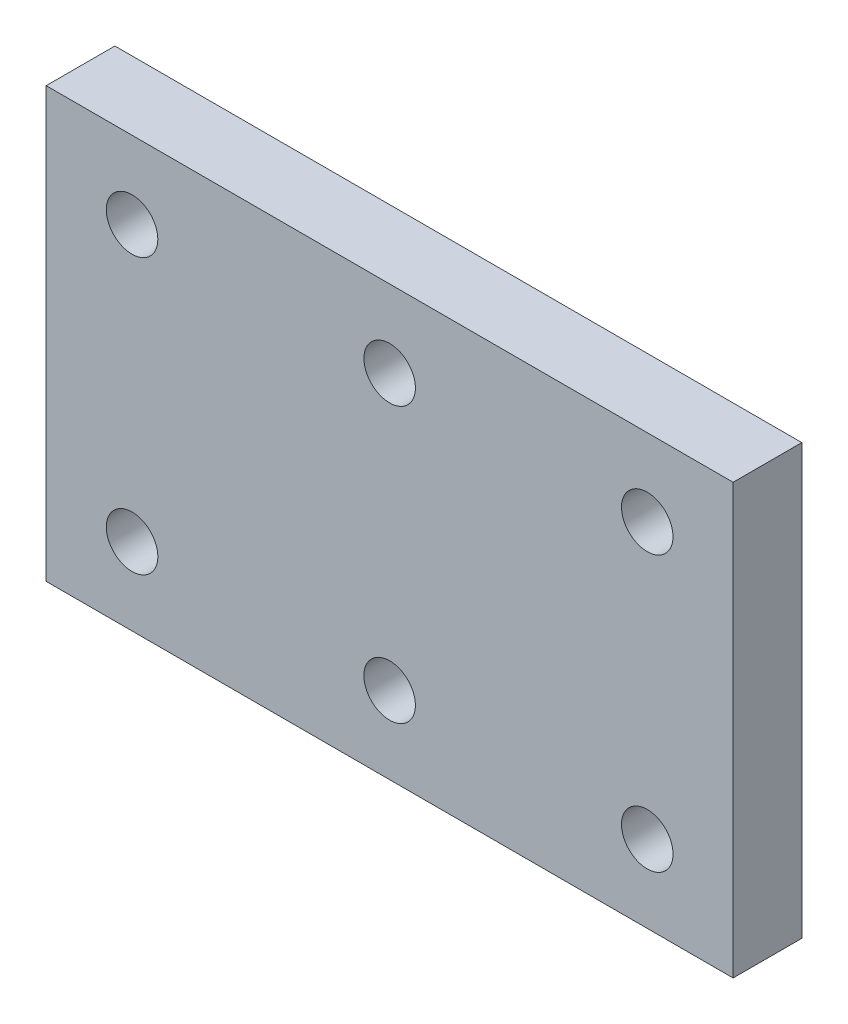
ISO-10303-21;
HEADER;
FILE_DESCRIPTION(('STEP AP214'),'2;1');
FILE_NAME('part.step','',(''),(''),'','','');
FILE_SCHEMA(('AUTOMOTIVE_DESIGN { 1 0 10303 214 1 1 1 1 }'));
ENDSEC;
DATA;
#1=APPLICATION_CONTEXT('core data for automotive mechanical design processes');
#2=APPLICATION_PROTOCOL_DEFINITION('international standard','automotive_design',2000,#1);
#3=PRODUCT_CONTEXT('',#1,'mechanical');
#4=PRODUCT('Part','Part','',(#3));
#5=PRODUCT_RELATED_PRODUCT_CATEGORY('part','',(#4));
#6=PRODUCT_DEFINITION_FORMATION('','',#4);
#7=PRODUCT_DEFINITION_CONTEXT('part definition',#1,'design');
#8=PRODUCT_DEFINITION('design','',#6,#7);
#9=PRODUCT_DEFINITION_SHAPE('','',#8);
#10=(LENGTH_UNIT() NAMED_UNIT(*) SI_UNIT(.MILLI.,.METRE.));
#11=(NAMED_UNIT(*) PLANE_ANGLE_UNIT() SI_UNIT($,.RADIAN.));
#12=(NAMED_UNIT(*) SI_UNIT($,.STERADIAN.) SOLID_ANGLE_UNIT());
#13=UNCERTAINTY_MEASURE_WITH_UNIT(LENGTH_MEASURE(1.E-05),#10,'distance_accuracy_value','');
#14=(GEOMETRIC_REPRESENTATION_CONTEXT(3) GLOBAL_UNCERTAINTY_ASSIGNED_CONTEXT((#13)) GLOBAL_UNIT_ASSIGNED_CONTEXT((#10,
#11,#12)) REPRESENTATION_CONTEXT('',''));
#15=CARTESIAN_POINT('',(0.,0.,0.));
#16=DIRECTION('',(0.,0.,1.));
#17=DIRECTION('',(1.,0.,0.));
#18=AXIS2_PLACEMENT_3D('',#15,#16,#17);
#19=CARTESIAN_POINT('',(20.,-12.5,4.));
#20=DIRECTION('',(-1.,0.,0.));
#21=DIRECTION('',(0.,0.,1.));
#22=AXIS2_PLACEMENT_3D('',#19,#20,#21);
#23=PLANE('',#22);
#24=DIRECTION('',(0.,1.,0.));
#25=VECTOR('',#24,1.);
#26=CARTESIAN_POINT('',(20.,-12.5,0.));
#27=LINE('',#26,#25);
#28=CARTESIAN_POINT('',(20.,-12.5,0.));
#29=VERTEX_POINT('',#28);
#30=CARTESIAN_POINT('',(20.,12.5,0.));
#31=VERTEX_POINT('',#30);
#32=EDGE_CURVE('E101',#29,#31,#27,.T.);
#33=ORIENTED_EDGE('',*,*,#32,.T.);
#34=DIRECTION('',(0.,0.,-1.));
#35=VECTOR('',#34,1.);
#36=CARTESIAN_POINT('',(20.,12.5,4.));
#37=LINE('',#36,#35);
#38=CARTESIAN_POINT('',(20.,12.5,4.));
#39=VERTEX_POINT('',#38);
#40=EDGE_CURVE('E11',#39,#31,#37,.T.);
#41=ORIENTED_EDGE('',*,*,#40,.F.);
#42=DIRECTION('',(0.,1.,0.));
#43=VECTOR('',#42,1.);
#44=CARTESIAN_POINT('',(20.,-12.5,4.));
#45=LINE('',#44,#43);
#46=CARTESIAN_POINT('',(20.,-12.5,4.));
#47=VERTEX_POINT('',#46);
#48=EDGE_CURVE('E89',#47,#39,#45,.T.);
#49=ORIENTED_EDGE('',*,*,#48,.F.);
#50=DIRECTION('',(0.,0.,-1.));
#51=VECTOR('',#50,1.);
#52=CARTESIAN_POINT('',(20.,-12.5,4.));
#53=LINE('',#52,#51);
#54=EDGE_CURVE('E97',#47,#29,#53,.T.);
#55=ORIENTED_EDGE('',*,*,#54,.T.);
#56=EDGE_LOOP('',(#33,#41,#49,#55));
#57=FACE_BOUND('',#56,.T.);
#58=ADVANCED_FACE('F38',(#57),#23,.F.);
#59=CARTESIAN_POINT('',(-20.,12.5,4.));
#60=DIRECTION('',(0.,-1.,0.));
#61=DIRECTION('',(0.,0.,-1.));
#62=AXIS2_PLACEMENT_3D('',#59,#60,#61);
#63=PLANE('',#62);
#64=DIRECTION('',(-1.,0.,0.));
#65=VECTOR('',#64,1.);
#66=CARTESIAN_POINT('',(-20.,12.5,0.));
#67=LINE('',#66,#65);
#68=CARTESIAN_POINT('',(-20.,12.5,0.));
#69=VERTEX_POINT('',#68);
#70=EDGE_CURVE('E93',#31,#69,#67,.T.);
#71=ORIENTED_EDGE('',*,*,#70,.T.);
#72=DIRECTION('',(0.,0.,-1.));
#73=VECTOR('',#72,1.);
#74=CARTESIAN_POINT('',(-20.,12.5,4.));
#75=LINE('',#74,#73);
#76=CARTESIAN_POINT('',(-20.,12.5,4.));
#77=VERTEX_POINT('',#76);
#78=EDGE_CURVE('E46',#77,#69,#75,.T.);
#79=ORIENTED_EDGE('',*,*,#78,.F.);
#80=DIRECTION('',(-1.,0.,0.));
#81=VECTOR('',#80,1.);
#82=CARTESIAN_POINT('',(-20.,12.5,4.));
#83=LINE('',#82,#81);
#84=EDGE_CURVE('E84',#39,#77,#83,.T.);
#85=ORIENTED_EDGE('',*,*,#84,.F.);
#86=ORIENTED_EDGE('',*,*,#40,.T.);
#87=EDGE_LOOP('',(#71,#79,#85,#86));
#88=FACE_BOUND('',#87,.T.);
#89=ADVANCED_FACE('F92',(#88),#63,.F.);
#90=CARTESIAN_POINT('',(-20.,-12.5,4.));
#91=DIRECTION('',(1.,0.,0.));
#92=DIRECTION('',(0.,0.,-1.));
#93=AXIS2_PLACEMENT_3D('',#90,#91,#92);
#94=PLANE('',#93);
#95=DIRECTION('',(0.,-1.,0.));
#96=VECTOR('',#95,1.);
#97=CARTESIAN_POINT('',(-20.,-12.5,0.));
#98=LINE('',#97,#96);
#99=CARTESIAN_POINT('',(-20.,-12.5,0.));
#100=VERTEX_POINT('',#99);
#101=EDGE_CURVE('E71',#69,#100,#98,.T.);
#102=ORIENTED_EDGE('',*,*,#101,.T.);
#103=DIRECTION('',(0.,0.,-1.));
#104=VECTOR('',#103,1.);
#105=CARTESIAN_POINT('',(-20.,-12.5,4.));
#106=LINE('',#105,#104);
#107=CARTESIAN_POINT('',(-20.,-12.5,4.));
#108=VERTEX_POINT('',#107);
#109=EDGE_CURVE('E94',#108,#100,#106,.T.);
#110=ORIENTED_EDGE('',*,*,#109,.F.);
#111=DIRECTION('',(0.,-1.,0.));
#112=VECTOR('',#111,1.);
#113=CARTESIAN_POINT('',(-20.,-12.5,4.));
#114=LINE('',#113,#112);
#115=EDGE_CURVE('E87',#77,#108,#114,.T.);
#116=ORIENTED_EDGE('',*,*,#115,.F.);
#117=ORIENTED_EDGE('',*,*,#78,.T.);
#118=EDGE_LOOP('',(#102,#110,#116,#117));
#119=FACE_BOUND('',#118,.T.);
#120=ADVANCED_FACE('F95',(#119),#94,.F.);
#121=CARTESIAN_POINT('',(-20.,-12.5,4.));
#122=DIRECTION('',(0.,1.,0.));
#123=DIRECTION('',(0.,0.,1.));
#124=AXIS2_PLACEMENT_3D('',#121,#122,#123);
#125=PLANE('',#124);
#126=DIRECTION('',(1.,0.,0.));
#127=VECTOR('',#126,1.);
#128=CARTESIAN_POINT('',(-20.,-12.5,0.));
#129=LINE('',#128,#127);
#130=EDGE_CURVE('E77',#100,#29,#129,.T.);
#131=ORIENTED_EDGE('',*,*,#130,.T.);
#132=ORIENTED_EDGE('',*,*,#54,.F.);
#133=DIRECTION('',(1.,0.,0.));
#134=VECTOR('',#133,1.);
#135=CARTESIAN_POINT('',(-20.,-12.5,4.));
#136=LINE('',#135,#134);
#137=EDGE_CURVE('E54',#108,#47,#136,.T.);
#138=ORIENTED_EDGE('',*,*,#137,.F.);
#139=ORIENTED_EDGE('',*,*,#109,.T.);
#140=EDGE_LOOP('',(#131,#132,#138,#139));
#141=FACE_BOUND('',#140,.T.);
#142=ADVANCED_FACE('F109',(#141),#125,.F.);
#143=CARTESIAN_POINT('',(0.,0.,4.));
#144=DIRECTION('',(0.,0.,-1.));
#145=DIRECTION('',(-1.,0.,0.));
#146=AXIS2_PLACEMENT_3D('',#143,#144,#145);
#147=PLANE('',#146);
#148=CARTESIAN_POINT('',(-15.,-8.,4.));
#149=DIRECTION('',(0.,0.,1.));
#150=DIRECTION('',(-1.,0.,0.));
#151=AXIS2_PLACEMENT_3D('',#148,#149,#150);
#152=CIRCLE('',#151,1.5);
#153=CARTESIAN_POINT('',(-16.5,-8.,4.));
#154=VERTEX_POINT('',#153);
#155=EDGE_CURVE('E121',#154,#154,#152,.T.);
#156=ORIENTED_EDGE('',*,*,#155,.F.);
#157=EDGE_LOOP('',(#156));
#158=FACE_BOUND('',#157,.T.);
#159=CARTESIAN_POINT('',(0.,-8.,4.));
#160=DIRECTION('',(0.,0.,1.));
#161=DIRECTION('',(-1.,0.,0.));
#162=AXIS2_PLACEMENT_3D('',#159,#160,#161);
#163=CIRCLE('',#162,1.5);
#164=CARTESIAN_POINT('',(-1.5,-8.,4.));
#165=VERTEX_POINT('',#164);
#166=EDGE_CURVE('E127',#165,#165,#163,.T.);
#167=ORIENTED_EDGE('',*,*,#166,.F.);
#168=EDGE_LOOP('',(#167));
#169=FACE_BOUND('',#168,.T.);
#170=CARTESIAN_POINT('',(15.,-8.,4.));
#171=DIRECTION('',(0.,0.,1.));
#172=DIRECTION('',(1.,0.,0.));
#173=AXIS2_PLACEMENT_3D('',#170,#171,#172);
#174=CIRCLE('',#173,1.5);
#175=CARTESIAN_POINT('',(16.5,-8.,4.));
#176=VERTEX_POINT('',#175);
#177=EDGE_CURVE('E133',#176,#176,#174,.T.);
#178=ORIENTED_EDGE('',*,*,#177,.F.);
#179=EDGE_LOOP('',(#178));
#180=FACE_BOUND('',#179,.T.);
#181=CARTESIAN_POINT('',(15.,8.,4.));
#182=DIRECTION('',(0.,0.,1.));
#183=DIRECTION('',(-1.,0.,0.));
#184=AXIS2_PLACEMENT_3D('',#181,#182,#183);
#185=CIRCLE('',#184,1.5);
#186=CARTESIAN_POINT('',(13.5,8.,4.));
#187=VERTEX_POINT('',#186);
#188=EDGE_CURVE('E139',#187,#187,#185,.T.);
#189=ORIENTED_EDGE('',*,*,#188,.F.);
#190=EDGE_LOOP('',(#189));
#191=FACE_BOUND('',#190,.T.);
#192=CARTESIAN_POINT('',(0.,8.,4.));
#193=DIRECTION('',(0.,0.,1.));
#194=DIRECTION('',(1.,0.,0.));
#195=AXIS2_PLACEMENT_3D('',#192,#193,#194);
#196=CIRCLE('',#195,1.5);
#197=CARTESIAN_POINT('',(1.5,8.,4.));
#198=VERTEX_POINT('',#197);
#199=EDGE_CURVE('E145',#198,#198,#196,.T.);
#200=ORIENTED_EDGE('',*,*,#199,.F.);
#201=EDGE_LOOP('',(#200));
#202=FACE_BOUND('',#201,.T.);
#203=CARTESIAN_POINT('',(-15.,8.,4.));
#204=DIRECTION('',(0.,0.,1.));
#205=DIRECTION('',(1.,0.,0.));
#206=AXIS2_PLACEMENT_3D('',#203,#204,#205);
#207=CIRCLE('',#206,1.5);
#208=CARTESIAN_POINT('',(-13.5,8.,4.));
#209=VERTEX_POINT('',#208);
#210=EDGE_CURVE('E115',#209,#209,#207,.T.);
#211=ORIENTED_EDGE('',*,*,#210,.F.);
#212=EDGE_LOOP('',(#211));
#213=FACE_BOUND('',#212,.T.);
#214=ORIENTED_EDGE('',*,*,#48,.T.);
#215=ORIENTED_EDGE('',*,*,#84,.T.);
#216=ORIENTED_EDGE('',*,*,#115,.T.);
#217=ORIENTED_EDGE('',*,*,#137,.T.);
#218=EDGE_LOOP('',(#214,#215,#216,#217));
#219=FACE_BOUND('',#218,.T.);
#220=ADVANCED_FACE('F85',(#158,#169,#180,#191,#202,#213,#219),#147,.F.);
#221=CARTESIAN_POINT('',(0.,0.,0.));
#222=DIRECTION('',(0.,0.,-1.));
#223=DIRECTION('',(-1.,0.,0.));
#224=AXIS2_PLACEMENT_3D('',#221,#222,#223);
#225=PLANE('',#224);
#226=CARTESIAN_POINT('',(-15.,-8.,0.));
#227=DIRECTION('',(0.,0.,1.));
#228=DIRECTION('',(-1.,0.,0.));
#229=AXIS2_PLACEMENT_3D('',#226,#227,#228);
#230=CIRCLE('',#229,1.5);
#231=CARTESIAN_POINT('',(-16.5,-8.,0.));
#232=VERTEX_POINT('',#231);
#233=EDGE_CURVE('E124',#232,#232,#230,.T.);
#234=ORIENTED_EDGE('',*,*,#233,.T.);
#235=EDGE_LOOP('',(#234));
#236=FACE_BOUND('',#235,.T.);
#237=CARTESIAN_POINT('',(0.,-8.,0.));
#238=DIRECTION('',(0.,0.,1.));
#239=DIRECTION('',(-1.,0.,0.));
#240=AXIS2_PLACEMENT_3D('',#237,#238,#239);
#241=CIRCLE('',#240,1.5);
#242=CARTESIAN_POINT('',(-1.5,-8.,0.));
#243=VERTEX_POINT('',#242);
#244=EDGE_CURVE('E130',#243,#243,#241,.T.);
#245=ORIENTED_EDGE('',*,*,#244,.T.);
#246=EDGE_LOOP('',(#245));
#247=FACE_BOUND('',#246,.T.);
#248=CARTESIAN_POINT('',(15.,-8.,0.));
#249=DIRECTION('',(0.,0.,1.));
#250=DIRECTION('',(1.,0.,0.));
#251=AXIS2_PLACEMENT_3D('',#248,#249,#250);
#252=CIRCLE('',#251,1.5);
#253=CARTESIAN_POINT('',(16.5,-8.,0.));
#254=VERTEX_POINT('',#253);
#255=EDGE_CURVE('E136',#254,#254,#252,.T.);
#256=ORIENTED_EDGE('',*,*,#255,.T.);
#257=EDGE_LOOP('',(#256));
#258=FACE_BOUND('',#257,.T.);
#259=CARTESIAN_POINT('',(15.,8.,0.));
#260=DIRECTION('',(0.,0.,1.));
#261=DIRECTION('',(-1.,0.,0.));
#262=AXIS2_PLACEMENT_3D('',#259,#260,#261);
#263=CIRCLE('',#262,1.5);
#264=CARTESIAN_POINT('',(13.5,8.,0.));
#265=VERTEX_POINT('',#264);
#266=EDGE_CURVE('E142',#265,#265,#263,.T.);
#267=ORIENTED_EDGE('',*,*,#266,.T.);
#268=EDGE_LOOP('',(#267));
#269=FACE_BOUND('',#268,.T.);
#270=CARTESIAN_POINT('',(0.,8.,0.));
#271=DIRECTION('',(0.,0.,1.));
#272=DIRECTION('',(1.,0.,0.));
#273=AXIS2_PLACEMENT_3D('',#270,#271,#272);
#274=CIRCLE('',#273,1.5);
#275=CARTESIAN_POINT('',(1.5,8.,0.));
#276=VERTEX_POINT('',#275);
#277=EDGE_CURVE('E118',#276,#276,#274,.T.);
#278=ORIENTED_EDGE('',*,*,#277,.T.);
#279=EDGE_LOOP('',(#278));
#280=FACE_BOUND('',#279,.T.);
#281=CARTESIAN_POINT('',(-15.,8.,0.));
#282=DIRECTION('',(0.,0.,1.));
#283=DIRECTION('',(1.,0.,0.));
#284=AXIS2_PLACEMENT_3D('',#281,#282,#283);
#285=CIRCLE('',#284,1.5);
#286=CARTESIAN_POINT('',(-13.5,8.,0.));
#287=VERTEX_POINT('',#286);
#288=EDGE_CURVE('E104',#287,#287,#285,.T.);
#289=ORIENTED_EDGE('',*,*,#288,.T.);
#290=EDGE_LOOP('',(#289));
#291=FACE_BOUND('',#290,.T.);
#292=ORIENTED_EDGE('',*,*,#32,.F.);
#293=ORIENTED_EDGE('',*,*,#130,.F.);
#294=ORIENTED_EDGE('',*,*,#101,.F.);
#295=ORIENTED_EDGE('',*,*,#70,.F.);
#296=EDGE_LOOP('',(#292,#293,#294,#295));
#297=FACE_BOUND('',#296,.T.);
#298=ADVANCED_FACE('F112',(#236,#247,#258,#269,#280,#291,#297),#225,.T.);
#299=CARTESIAN_POINT('',(-15.,8.,0.));
#300=DIRECTION('',(0.,0.,1.));
#301=DIRECTION('',(1.,0.,0.));
#302=AXIS2_PLACEMENT_3D('',#299,#300,#301);
#303=CYLINDRICAL_SURFACE('',#302,1.5);
#304=ORIENTED_EDGE('',*,*,#288,.F.);
#305=EDGE_LOOP('',(#304));
#306=FACE_BOUND('',#305,.T.);
#307=ORIENTED_EDGE('',*,*,#210,.T.);
#308=EDGE_LOOP('',(#307));
#309=FACE_BOUND('',#308,.T.);
#310=ADVANCED_FACE('F157',(#306,#309),#303,.F.);
#311=CARTESIAN_POINT('',(0.,8.,0.));
#312=DIRECTION('',(0.,0.,1.));
#313=DIRECTION('',(1.,0.,0.));
#314=AXIS2_PLACEMENT_3D('',#311,#312,#313);
#315=CYLINDRICAL_SURFACE('',#314,1.5);
#316=ORIENTED_EDGE('',*,*,#277,.F.);
#317=EDGE_LOOP('',(#316));
#318=FACE_BOUND('',#317,.T.);
#319=ORIENTED_EDGE('',*,*,#199,.T.);
#320=EDGE_LOOP('',(#319));
#321=FACE_BOUND('',#320,.T.);
#322=ADVANCED_FACE('F153',(#318,#321),#315,.F.);
#323=CARTESIAN_POINT('',(15.,8.,0.));
#324=DIRECTION('',(0.,0.,1.));
#325=DIRECTION('',(1.,0.,0.));
#326=AXIS2_PLACEMENT_3D('',#323,#324,#325);
#327=CYLINDRICAL_SURFACE('',#326,1.5);
#328=ORIENTED_EDGE('',*,*,#266,.F.);
#329=EDGE_LOOP('',(#328));
#330=FACE_BOUND('',#329,.T.);
#331=ORIENTED_EDGE('',*,*,#188,.T.);
#332=EDGE_LOOP('',(#331));
#333=FACE_BOUND('',#332,.T.);
#334=ADVANCED_FACE('F156',(#330,#333),#327,.F.);
#335=CARTESIAN_POINT('',(15.,-8.,0.));
#336=DIRECTION('',(0.,0.,1.));
#337=DIRECTION('',(1.,0.,0.));
#338=AXIS2_PLACEMENT_3D('',#335,#336,#337);
#339=CYLINDRICAL_SURFACE('',#338,1.5);
#340=ORIENTED_EDGE('',*,*,#255,.F.);
#341=EDGE_LOOP('',(#340));
#342=FACE_BOUND('',#341,.T.);
#343=ORIENTED_EDGE('',*,*,#177,.T.);
#344=EDGE_LOOP('',(#343));
#345=FACE_BOUND('',#344,.T.);
#346=ADVANCED_FACE('F218',(#342,#345),#339,.F.);
#347=CARTESIAN_POINT('',(0.,-8.,0.));
#348=DIRECTION('',(0.,0.,1.));
#349=DIRECTION('',(1.,0.,0.));
#350=AXIS2_PLACEMENT_3D('',#347,#348,#349);
#351=CYLINDRICAL_SURFACE('',#350,1.5);
#352=ORIENTED_EDGE('',*,*,#244,.F.);
#353=EDGE_LOOP('',(#352));
#354=FACE_BOUND('',#353,.T.);
#355=ORIENTED_EDGE('',*,*,#166,.T.);
#356=EDGE_LOOP('',(#355));
#357=FACE_BOUND('',#356,.T.);
#358=ADVANCED_FACE('F228',(#354,#357),#351,.F.);
#359=CARTESIAN_POINT('',(-15.,-8.,0.));
#360=DIRECTION('',(0.,0.,1.));
#361=DIRECTION('',(1.,0.,0.));
#362=AXIS2_PLACEMENT_3D('',#359,#360,#361);
#363=CYLINDRICAL_SURFACE('',#362,1.5);
#364=ORIENTED_EDGE('',*,*,#233,.F.);
#365=EDGE_LOOP('',(#364));
#366=FACE_BOUND('',#365,.T.);
#367=ORIENTED_EDGE('',*,*,#155,.T.);
#368=EDGE_LOOP('',(#367));
#369=FACE_BOUND('',#368,.T.);
#370=ADVANCED_FACE('F238',(#366,#369),#363,.F.);
#371=CLOSED_SHELL('',(#58,#89,#120,#142,#220,#298,#310,#322,#334,#346,#358,#370));
#372=MANIFOLD_SOLID_BREP('B2',#371);
#373=ADVANCED_BREP_SHAPE_REPRESENTATION('',(#18,#372),#14);
#374=SHAPE_DEFINITION_REPRESENTATION(#9,#373);
ENDSEC;
END-ISO-10303-21;
